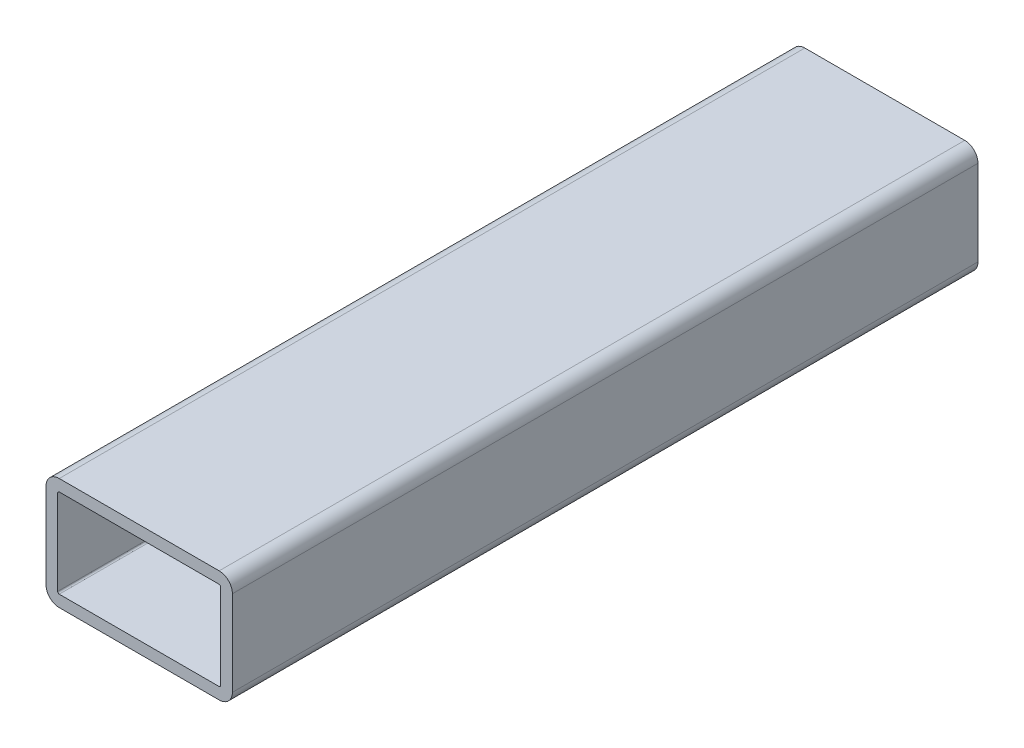
ISO-10303-21;
HEADER;
FILE_DESCRIPTION(('STEP AP214'),'2;1');
FILE_NAME('part.step','',(''),(''),'','','');
FILE_SCHEMA(('AUTOMOTIVE_DESIGN { 1 0 10303 214 1 1 1 1 }'));
ENDSEC;
DATA;
#1=APPLICATION_CONTEXT('core data for automotive mechanical design processes');
#2=APPLICATION_PROTOCOL_DEFINITION('international standard','automotive_design',2000,#1);
#3=PRODUCT_CONTEXT('',#1,'mechanical');
#4=PRODUCT('Part','Part','',(#3));
#5=PRODUCT_RELATED_PRODUCT_CATEGORY('part','',(#4));
#6=PRODUCT_DEFINITION_FORMATION('','',#4);
#7=PRODUCT_DEFINITION_CONTEXT('part definition',#1,'design');
#8=PRODUCT_DEFINITION('design','',#6,#7);
#9=PRODUCT_DEFINITION_SHAPE('','',#8);
#10=(LENGTH_UNIT() NAMED_UNIT(*) SI_UNIT(.MILLI.,.METRE.));
#11=(NAMED_UNIT(*) PLANE_ANGLE_UNIT() SI_UNIT($,.RADIAN.));
#12=(NAMED_UNIT(*) SI_UNIT($,.STERADIAN.) SOLID_ANGLE_UNIT());
#13=UNCERTAINTY_MEASURE_WITH_UNIT(LENGTH_MEASURE(1.E-05),#10,'distance_accuracy_value','');
#14=(GEOMETRIC_REPRESENTATION_CONTEXT(3) GLOBAL_UNCERTAINTY_ASSIGNED_CONTEXT((#13)) GLOBAL_UNIT_ASSIGNED_CONTEXT((#10,
#11,#12)) REPRESENTATION_CONTEXT('',''));
#15=CARTESIAN_POINT('',(0.,0.,0.));
#16=DIRECTION('',(0.,0.,1.));
#17=DIRECTION('',(1.,0.,0.));
#18=AXIS2_PLACEMENT_3D('',#15,#16,#17);
#19=CARTESIAN_POINT('',(-85.8000000000001,45.7999999999997,400.));
#20=DIRECTION('',(0.,0.,-1.));
#21=DIRECTION('',(-1.,0.,0.));
#22=AXIS2_PLACEMENT_3D('',#19,#20,#21);
#23=CYLINDRICAL_SURFACE('',#22,14.2000000000001);
#24=CARTESIAN_POINT('',(-85.8000000000001,45.7999999999997,-400.));
#25=DIRECTION('',(0.,0.,1.));
#26=DIRECTION('',(1.,0.,0.));
#27=AXIS2_PLACEMENT_3D('',#24,#25,#26);
#28=CIRCLE('',#27,14.2000000000001);
#29=CARTESIAN_POINT('',(-85.8000000000001,59.9999999999997,-400.));
#30=VERTEX_POINT('',#29);
#31=CARTESIAN_POINT('',(-100.,45.7999999999996,-400.));
#32=VERTEX_POINT('',#31);
#33=EDGE_CURVE('E237',#30,#32,#28,.T.);
#34=ORIENTED_EDGE('',*,*,#33,.T.);
#35=DIRECTION('',(0.,0.,-1.));
#36=VECTOR('',#35,1.);
#37=CARTESIAN_POINT('',(-100.,45.7999999999996,400.));
#38=LINE('',#37,#36);
#39=CARTESIAN_POINT('',(-100.,45.7999999999996,400.));
#40=VERTEX_POINT('',#39);
#41=EDGE_CURVE('E12',#40,#32,#38,.T.);
#42=ORIENTED_EDGE('',*,*,#41,.F.);
#43=CARTESIAN_POINT('',(-85.8000000000001,45.7999999999997,400.));
#44=DIRECTION('',(0.,0.,1.));
#45=DIRECTION('',(1.,0.,0.));
#46=AXIS2_PLACEMENT_3D('',#43,#44,#45);
#47=CIRCLE('',#46,14.2000000000001);
#48=CARTESIAN_POINT('',(-85.8000000000001,59.9999999999997,400.));
#49=VERTEX_POINT('',#48);
#50=EDGE_CURVE('E315',#49,#40,#47,.T.);
#51=ORIENTED_EDGE('',*,*,#50,.F.);
#52=DIRECTION('',(0.,0.,-1.));
#53=VECTOR('',#52,1.);
#54=CARTESIAN_POINT('',(-85.8000000000001,59.9999999999997,400.));
#55=LINE('',#54,#53);
#56=EDGE_CURVE('E252',#49,#30,#55,.T.);
#57=ORIENTED_EDGE('',*,*,#56,.T.);
#58=EDGE_LOOP('',(#34,#42,#51,#57));
#59=FACE_BOUND('',#58,.T.);
#60=ADVANCED_FACE('F65',(#59),#23,.T.);
#61=CARTESIAN_POINT('',(-100.,45.7999999999996,400.));
#62=DIRECTION('',(1.,0.,0.));
#63=DIRECTION('',(0.,1.,0.));
#64=AXIS2_PLACEMENT_3D('',#61,#62,#63);
#65=PLANE('',#64);
#66=DIRECTION('',(0.,-1.,0.));
#67=VECTOR('',#66,1.);
#68=CARTESIAN_POINT('',(-100.,45.7999999999996,-400.));
#69=LINE('',#68,#67);
#70=CARTESIAN_POINT('',(-99.9999999999998,-45.8000000000003,-400.));
#71=VERTEX_POINT('',#70);
#72=EDGE_CURVE('E240',#32,#71,#69,.T.);
#73=ORIENTED_EDGE('',*,*,#72,.T.);
#74=DIRECTION('',(0.,0.,-1.));
#75=VECTOR('',#74,1.);
#76=CARTESIAN_POINT('',(-99.9999999999998,-45.8000000000003,400.));
#77=LINE('',#76,#75);
#78=CARTESIAN_POINT('',(-99.9999999999998,-45.8000000000003,400.));
#79=VERTEX_POINT('',#78);
#80=EDGE_CURVE('E75',#79,#71,#77,.T.);
#81=ORIENTED_EDGE('',*,*,#80,.F.);
#82=DIRECTION('',(0.,-1.,0.));
#83=VECTOR('',#82,1.);
#84=CARTESIAN_POINT('',(-100.,45.7999999999996,400.));
#85=LINE('',#84,#83);
#86=EDGE_CURVE('E317',#40,#79,#85,.T.);
#87=ORIENTED_EDGE('',*,*,#86,.F.);
#88=ORIENTED_EDGE('',*,*,#41,.T.);
#89=EDGE_LOOP('',(#73,#81,#87,#88));
#90=FACE_BOUND('',#89,.T.);
#91=ADVANCED_FACE('F352',(#90),#65,.F.);
#92=CARTESIAN_POINT('',(-85.7999999999998,-45.8000000000003,400.));
#93=DIRECTION('',(0.,0.,-1.));
#94=DIRECTION('',(-1.,0.,0.));
#95=AXIS2_PLACEMENT_3D('',#92,#93,#94);
#96=CYLINDRICAL_SURFACE('',#95,14.2000000000001);
#97=CARTESIAN_POINT('',(-85.7999999999998,-45.8000000000003,-400.));
#98=DIRECTION('',(0.,0.,1.));
#99=DIRECTION('',(1.,0.,0.));
#100=AXIS2_PLACEMENT_3D('',#97,#98,#99);
#101=CIRCLE('',#100,14.2000000000001);
#102=CARTESIAN_POINT('',(-85.7999999999997,-60.0000000000003,-400.));
#103=VERTEX_POINT('',#102);
#104=EDGE_CURVE('E242',#71,#103,#101,.T.);
#105=ORIENTED_EDGE('',*,*,#104,.T.);
#106=DIRECTION('',(0.,0.,-1.));
#107=VECTOR('',#106,1.);
#108=CARTESIAN_POINT('',(-85.7999999999997,-60.0000000000003,400.));
#109=LINE('',#108,#107);
#110=CARTESIAN_POINT('',(-85.7999999999997,-60.0000000000003,400.));
#111=VERTEX_POINT('',#110);
#112=EDGE_CURVE('E259',#111,#103,#109,.T.);
#113=ORIENTED_EDGE('',*,*,#112,.F.);
#114=CARTESIAN_POINT('',(-85.7999999999998,-45.8000000000003,400.));
#115=DIRECTION('',(0.,0.,1.));
#116=DIRECTION('',(1.,0.,0.));
#117=AXIS2_PLACEMENT_3D('',#114,#115,#116);
#118=CIRCLE('',#117,14.2000000000001);
#119=EDGE_CURVE('E319',#79,#111,#118,.T.);
#120=ORIENTED_EDGE('',*,*,#119,.F.);
#121=ORIENTED_EDGE('',*,*,#80,.T.);
#122=EDGE_LOOP('',(#105,#113,#120,#121));
#123=FACE_BOUND('',#122,.T.);
#124=ADVANCED_FACE('F357',(#123),#96,.T.);
#125=CARTESIAN_POINT('',(85.8000000000002,-59.9999999999997,400.));
#126=DIRECTION('',(0.,1.,0.));
#127=DIRECTION('',(-1.,0.,0.));
#128=AXIS2_PLACEMENT_3D('',#125,#126,#127);
#129=PLANE('',#128);
#130=DIRECTION('',(1.,0.,0.));
#131=VECTOR('',#130,1.);
#132=CARTESIAN_POINT('',(85.8000000000002,-59.9999999999997,-400.));
#133=LINE('',#132,#131);
#134=CARTESIAN_POINT('',(85.8000000000002,-59.9999999999997,-400.));
#135=VERTEX_POINT('',#134);
#136=EDGE_CURVE('E244',#103,#135,#133,.T.);
#137=ORIENTED_EDGE('',*,*,#136,.T.);
#138=DIRECTION('',(0.,0.,-1.));
#139=VECTOR('',#138,1.);
#140=CARTESIAN_POINT('',(85.8000000000002,-59.9999999999997,400.));
#141=LINE('',#140,#139);
#142=CARTESIAN_POINT('',(85.8000000000002,-59.9999999999997,400.));
#143=VERTEX_POINT('',#142);
#144=EDGE_CURVE('E256',#143,#135,#141,.T.);
#145=ORIENTED_EDGE('',*,*,#144,.F.);
#146=DIRECTION('',(1.,0.,0.));
#147=VECTOR('',#146,1.);
#148=CARTESIAN_POINT('',(85.8000000000002,-59.9999999999997,400.));
#149=LINE('',#148,#147);
#150=EDGE_CURVE('E321',#111,#143,#149,.T.);
#151=ORIENTED_EDGE('',*,*,#150,.F.);
#152=ORIENTED_EDGE('',*,*,#112,.T.);
#153=EDGE_LOOP('',(#137,#145,#151,#152));
#154=FACE_BOUND('',#153,.T.);
#155=ADVANCED_FACE('F327',(#154),#129,.F.);
#156=CARTESIAN_POINT('',(85.8000000000001,-45.7999999999996,400.));
#157=DIRECTION('',(0.,0.,-1.));
#158=DIRECTION('',(-1.,0.,0.));
#159=AXIS2_PLACEMENT_3D('',#156,#157,#158);
#160=CYLINDRICAL_SURFACE('',#159,14.2000000000001);
#161=CARTESIAN_POINT('',(85.8000000000001,-45.7999999999996,-400.));
#162=DIRECTION('',(0.,0.,1.));
#163=DIRECTION('',(1.,0.,0.));
#164=AXIS2_PLACEMENT_3D('',#161,#162,#163);
#165=CIRCLE('',#164,14.2000000000001);
#166=CARTESIAN_POINT('',(100.,-45.7999999999996,-400.));
#167=VERTEX_POINT('',#166);
#168=EDGE_CURVE('E246',#135,#167,#165,.T.);
#169=ORIENTED_EDGE('',*,*,#168,.T.);
#170=DIRECTION('',(0.,0.,-1.));
#171=VECTOR('',#170,1.);
#172=CARTESIAN_POINT('',(100.,-45.7999999999996,400.));
#173=LINE('',#172,#171);
#174=CARTESIAN_POINT('',(100.,-45.7999999999996,400.));
#175=VERTEX_POINT('',#174);
#176=EDGE_CURVE('E204',#175,#167,#173,.T.);
#177=ORIENTED_EDGE('',*,*,#176,.F.);
#178=CARTESIAN_POINT('',(85.8000000000001,-45.7999999999996,400.));
#179=DIRECTION('',(0.,0.,1.));
#180=DIRECTION('',(1.,0.,0.));
#181=AXIS2_PLACEMENT_3D('',#178,#179,#180);
#182=CIRCLE('',#181,14.2000000000001);
#183=EDGE_CURVE('E195',#143,#175,#182,.T.);
#184=ORIENTED_EDGE('',*,*,#183,.F.);
#185=ORIENTED_EDGE('',*,*,#144,.T.);
#186=EDGE_LOOP('',(#169,#177,#184,#185));
#187=FACE_BOUND('',#186,.T.);
#188=ADVANCED_FACE('F331',(#187),#160,.T.);
#189=CARTESIAN_POINT('',(100.,-45.7999999999996,400.));
#190=DIRECTION('',(-1.,0.,0.));
#191=DIRECTION('',(0.,-1.,0.));
#192=AXIS2_PLACEMENT_3D('',#189,#190,#191);
#193=PLANE('',#192);
#194=DIRECTION('',(0.,1.,0.));
#195=VECTOR('',#194,1.);
#196=CARTESIAN_POINT('',(100.,-45.7999999999996,-400.));
#197=LINE('',#196,#195);
#198=CARTESIAN_POINT('',(99.9999999999998,45.8000000000003,-400.));
#199=VERTEX_POINT('',#198);
#200=EDGE_CURVE('E203',#167,#199,#197,.T.);
#201=ORIENTED_EDGE('',*,*,#200,.T.);
#202=DIRECTION('',(0.,0.,-1.));
#203=VECTOR('',#202,1.);
#204=CARTESIAN_POINT('',(99.9999999999998,45.8000000000003,400.));
#205=LINE('',#204,#203);
#206=CARTESIAN_POINT('',(99.9999999999998,45.8000000000003,400.));
#207=VERTEX_POINT('',#206);
#208=EDGE_CURVE('E200',#207,#199,#205,.T.);
#209=ORIENTED_EDGE('',*,*,#208,.F.);
#210=DIRECTION('',(0.,1.,0.));
#211=VECTOR('',#210,1.);
#212=CARTESIAN_POINT('',(100.,-45.7999999999996,400.));
#213=LINE('',#212,#211);
#214=EDGE_CURVE('E189',#175,#207,#213,.T.);
#215=ORIENTED_EDGE('',*,*,#214,.F.);
#216=ORIENTED_EDGE('',*,*,#176,.T.);
#217=EDGE_LOOP('',(#201,#209,#215,#216));
#218=FACE_BOUND('',#217,.T.);
#219=ADVANCED_FACE('F201',(#218),#193,.F.);
#220=CARTESIAN_POINT('',(85.7999999999998,45.8000000000003,400.));
#221=DIRECTION('',(0.,0.,-1.));
#222=DIRECTION('',(-1.,0.,0.));
#223=AXIS2_PLACEMENT_3D('',#220,#221,#222);
#224=CYLINDRICAL_SURFACE('',#223,14.2000000000001);
#225=CARTESIAN_POINT('',(85.7999999999998,45.8000000000003,-400.));
#226=DIRECTION('',(0.,0.,1.));
#227=DIRECTION('',(1.,0.,0.));
#228=AXIS2_PLACEMENT_3D('',#225,#226,#227);
#229=CIRCLE('',#228,14.2000000000001);
#230=CARTESIAN_POINT('',(85.7999999999997,60.0000000000003,-400.));
#231=VERTEX_POINT('',#230);
#232=EDGE_CURVE('E137',#199,#231,#229,.T.);
#233=ORIENTED_EDGE('',*,*,#232,.T.);
#234=DIRECTION('',(0.,0.,-1.));
#235=VECTOR('',#234,1.);
#236=CARTESIAN_POINT('',(85.7999999999997,60.0000000000003,400.));
#237=LINE('',#236,#235);
#238=CARTESIAN_POINT('',(85.7999999999997,60.0000000000003,400.));
#239=VERTEX_POINT('',#238);
#240=EDGE_CURVE('E205',#239,#231,#237,.T.);
#241=ORIENTED_EDGE('',*,*,#240,.F.);
#242=CARTESIAN_POINT('',(85.7999999999998,45.8000000000003,400.));
#243=DIRECTION('',(0.,0.,1.));
#244=DIRECTION('',(1.,0.,0.));
#245=AXIS2_PLACEMENT_3D('',#242,#243,#244);
#246=CIRCLE('',#245,14.2000000000001);
#247=EDGE_CURVE('E193',#207,#239,#246,.T.);
#248=ORIENTED_EDGE('',*,*,#247,.F.);
#249=ORIENTED_EDGE('',*,*,#208,.T.);
#250=EDGE_LOOP('',(#233,#241,#248,#249));
#251=FACE_BOUND('',#250,.T.);
#252=ADVANCED_FACE('F207',(#251),#224,.T.);
#253=CARTESIAN_POINT('',(-85.7999999999998,-45.8000000000003,400.));
#254=DIRECTION('',(0.,0.,-1.));
#255=DIRECTION('',(-1.,0.,0.));
#256=AXIS2_PLACEMENT_3D('',#253,#254,#255);
#257=CYLINDRICAL_SURFACE('',#256,1.70000000000003);
#258=CARTESIAN_POINT('',(-85.7999999999998,-45.8000000000003,-400.));
#259=DIRECTION('',(0.,0.,1.));
#260=DIRECTION('',(1.,0.,0.));
#261=AXIS2_PLACEMENT_3D('',#258,#259,#260);
#262=CIRCLE('',#261,1.70000000000003);
#263=CARTESIAN_POINT('',(-87.4999999999998,-45.8000000000002,-400.));
#264=VERTEX_POINT('',#263);
#265=CARTESIAN_POINT('',(-85.7999999999998,-47.5000000000003,-400.));
#266=VERTEX_POINT('',#265);
#267=EDGE_CURVE('E213',#264,#266,#262,.T.);
#268=ORIENTED_EDGE('',*,*,#267,.F.);
#269=DIRECTION('',(0.,0.,-1.));
#270=VECTOR('',#269,1.);
#271=CARTESIAN_POINT('',(-87.4999999999998,-45.8000000000002,400.));
#272=LINE('',#271,#270);
#273=CARTESIAN_POINT('',(-87.4999999999998,-45.8000000000002,400.));
#274=VERTEX_POINT('',#273);
#275=EDGE_CURVE('E69',#274,#264,#272,.T.);
#276=ORIENTED_EDGE('',*,*,#275,.F.);
#277=CARTESIAN_POINT('',(-85.7999999999998,-45.8000000000003,400.));
#278=DIRECTION('',(0.,0.,1.));
#279=DIRECTION('',(1.,0.,0.));
#280=AXIS2_PLACEMENT_3D('',#277,#278,#279);
#281=CIRCLE('',#280,1.70000000000003);
#282=CARTESIAN_POINT('',(-85.7999999999998,-47.5000000000003,400.));
#283=VERTEX_POINT('',#282);
#284=EDGE_CURVE('E251',#274,#283,#281,.T.);
#285=ORIENTED_EDGE('',*,*,#284,.T.);
#286=DIRECTION('',(0.,0.,-1.));
#287=VECTOR('',#286,1.);
#288=CARTESIAN_POINT('',(-85.7999999999998,-47.5000000000003,400.));
#289=LINE('',#288,#287);
#290=EDGE_CURVE('E209',#283,#266,#289,.T.);
#291=ORIENTED_EDGE('',*,*,#290,.T.);
#292=EDGE_LOOP('',(#268,#276,#285,#291));
#293=FACE_BOUND('',#292,.T.);
#294=ADVANCED_FACE('F67',(#293),#257,.F.);
#295=CARTESIAN_POINT('',(-87.5000000000001,45.7999999999996,400.));
#296=DIRECTION('',(1.,0.,0.));
#297=DIRECTION('',(0.,1.,0.));
#298=AXIS2_PLACEMENT_3D('',#295,#296,#297);
#299=PLANE('',#298);
#300=DIRECTION('',(0.,-1.,0.));
#301=VECTOR('',#300,1.);
#302=CARTESIAN_POINT('',(-87.5000000000001,45.7999999999996,-400.));
#303=LINE('',#302,#301);
#304=CARTESIAN_POINT('',(-87.5000000000001,45.7999999999996,-400.));
#305=VERTEX_POINT('',#304);
#306=EDGE_CURVE('E216',#305,#264,#303,.T.);
#307=ORIENTED_EDGE('',*,*,#306,.F.);
#308=DIRECTION('',(0.,0.,-1.));
#309=VECTOR('',#308,1.);
#310=CARTESIAN_POINT('',(-87.5000000000001,45.7999999999996,400.));
#311=LINE('',#310,#309);
#312=CARTESIAN_POINT('',(-87.5000000000001,45.7999999999996,400.));
#313=VERTEX_POINT('',#312);
#314=EDGE_CURVE('E274',#313,#305,#311,.T.);
#315=ORIENTED_EDGE('',*,*,#314,.F.);
#316=DIRECTION('',(0.,-1.,0.));
#317=VECTOR('',#316,1.);
#318=CARTESIAN_POINT('',(-87.5000000000001,45.7999999999996,400.));
#319=LINE('',#318,#317);
#320=EDGE_CURVE('E283',#313,#274,#319,.T.);
#321=ORIENTED_EDGE('',*,*,#320,.T.);
#322=ORIENTED_EDGE('',*,*,#275,.T.);
#323=EDGE_LOOP('',(#307,#315,#321,#322));
#324=FACE_BOUND('',#323,.T.);
#325=ADVANCED_FACE('F281',(#324),#299,.T.);
#326=CARTESIAN_POINT('',(-85.8000000000001,45.7999999999997,400.));
#327=DIRECTION('',(0.,0.,-1.));
#328=DIRECTION('',(-1.,0.,0.));
#329=AXIS2_PLACEMENT_3D('',#326,#327,#328);
#330=CYLINDRICAL_SURFACE('',#329,1.70000000000003);
#331=CARTESIAN_POINT('',(-85.8000000000001,45.7999999999997,-400.));
#332=DIRECTION('',(0.,0.,1.));
#333=DIRECTION('',(1.,0.,0.));
#334=AXIS2_PLACEMENT_3D('',#331,#332,#333);
#335=CIRCLE('',#334,1.70000000000003);
#336=CARTESIAN_POINT('',(-85.8000000000001,47.4999999999997,-400.));
#337=VERTEX_POINT('',#336);
#338=EDGE_CURVE('E219',#337,#305,#335,.T.);
#339=ORIENTED_EDGE('',*,*,#338,.F.);
#340=DIRECTION('',(0.,0.,-1.));
#341=VECTOR('',#340,1.);
#342=CARTESIAN_POINT('',(-85.8000000000001,47.4999999999997,400.));
#343=LINE('',#342,#341);
#344=CARTESIAN_POINT('',(-85.8000000000001,47.4999999999997,400.));
#345=VERTEX_POINT('',#344);
#346=EDGE_CURVE('E273',#345,#337,#343,.T.);
#347=ORIENTED_EDGE('',*,*,#346,.F.);
#348=CARTESIAN_POINT('',(-85.8000000000001,45.7999999999997,400.));
#349=DIRECTION('',(0.,0.,1.));
#350=DIRECTION('',(1.,0.,0.));
#351=AXIS2_PLACEMENT_3D('',#348,#349,#350);
#352=CIRCLE('',#351,1.70000000000003);
#353=EDGE_CURVE('E291',#345,#313,#352,.T.);
#354=ORIENTED_EDGE('',*,*,#353,.T.);
#355=ORIENTED_EDGE('',*,*,#314,.T.);
#356=EDGE_LOOP('',(#339,#347,#354,#355));
#357=FACE_BOUND('',#356,.T.);
#358=ADVANCED_FACE('F289',(#357),#330,.F.);
#359=CARTESIAN_POINT('',(-85.8000000000001,47.4999999999997,400.));
#360=DIRECTION('',(0.,-1.,0.));
#361=DIRECTION('',(1.,0.,0.));
#362=AXIS2_PLACEMENT_3D('',#359,#360,#361);
#363=PLANE('',#362);
#364=DIRECTION('',(-1.,0.,0.));
#365=VECTOR('',#364,1.);
#366=CARTESIAN_POINT('',(-85.8000000000001,47.4999999999997,-400.));
#367=LINE('',#366,#365);
#368=CARTESIAN_POINT('',(85.7999999999998,47.5000000000003,-400.));
#369=VERTEX_POINT('',#368);
#370=EDGE_CURVE('E222',#369,#337,#367,.T.);
#371=ORIENTED_EDGE('',*,*,#370,.F.);
#372=DIRECTION('',(0.,0.,-1.));
#373=VECTOR('',#372,1.);
#374=CARTESIAN_POINT('',(85.7999999999998,47.5000000000003,400.));
#375=LINE('',#374,#373);
#376=CARTESIAN_POINT('',(85.7999999999998,47.5000000000003,400.));
#377=VERTEX_POINT('',#376);
#378=EDGE_CURVE('E271',#377,#369,#375,.T.);
#379=ORIENTED_EDGE('',*,*,#378,.F.);
#380=DIRECTION('',(-1.,0.,0.));
#381=VECTOR('',#380,1.);
#382=CARTESIAN_POINT('',(-85.8000000000001,47.4999999999997,400.));
#383=LINE('',#382,#381);
#384=EDGE_CURVE('E297',#377,#345,#383,.T.);
#385=ORIENTED_EDGE('',*,*,#384,.T.);
#386=ORIENTED_EDGE('',*,*,#346,.T.);
#387=EDGE_LOOP('',(#371,#379,#385,#386));
#388=FACE_BOUND('',#387,.T.);
#389=ADVANCED_FACE('F300',(#388),#363,.T.);
#390=CARTESIAN_POINT('',(85.7999999999998,45.8000000000003,400.));
#391=DIRECTION('',(0.,0.,-1.));
#392=DIRECTION('',(-1.,0.,0.));
#393=AXIS2_PLACEMENT_3D('',#390,#391,#392);
#394=CYLINDRICAL_SURFACE('',#393,1.70000000000003);
#395=CARTESIAN_POINT('',(85.7999999999998,45.8000000000003,-400.));
#396=DIRECTION('',(0.,0.,1.));
#397=DIRECTION('',(1.,0.,0.));
#398=AXIS2_PLACEMENT_3D('',#395,#396,#397);
#399=CIRCLE('',#398,1.70000000000003);
#400=CARTESIAN_POINT('',(87.4999999999998,45.8000000000002,-400.));
#401=VERTEX_POINT('',#400);
#402=EDGE_CURVE('E225',#401,#369,#399,.T.);
#403=ORIENTED_EDGE('',*,*,#402,.F.);
#404=DIRECTION('',(0.,0.,-1.));
#405=VECTOR('',#404,1.);
#406=CARTESIAN_POINT('',(87.4999999999998,45.8000000000002,400.));
#407=LINE('',#406,#405);
#408=CARTESIAN_POINT('',(87.4999999999998,45.8000000000002,400.));
#409=VERTEX_POINT('',#408);
#410=EDGE_CURVE('E269',#409,#401,#407,.T.);
#411=ORIENTED_EDGE('',*,*,#410,.F.);
#412=CARTESIAN_POINT('',(85.7999999999998,45.8000000000003,400.));
#413=DIRECTION('',(0.,0.,1.));
#414=DIRECTION('',(1.,0.,0.));
#415=AXIS2_PLACEMENT_3D('',#412,#413,#414);
#416=CIRCLE('',#415,1.70000000000003);
#417=EDGE_CURVE('E301',#409,#377,#416,.T.);
#418=ORIENTED_EDGE('',*,*,#417,.T.);
#419=ORIENTED_EDGE('',*,*,#378,.T.);
#420=EDGE_LOOP('',(#403,#411,#418,#419));
#421=FACE_BOUND('',#420,.T.);
#422=ADVANCED_FACE('F368',(#421),#394,.F.);
#423=CARTESIAN_POINT('',(87.5000000000001,-45.7999999999996,400.));
#424=DIRECTION('',(-1.,0.,0.));
#425=DIRECTION('',(0.,-1.,0.));
#426=AXIS2_PLACEMENT_3D('',#423,#424,#425);
#427=PLANE('',#426);
#428=DIRECTION('',(0.,1.,0.));
#429=VECTOR('',#428,1.);
#430=CARTESIAN_POINT('',(87.5000000000001,-45.7999999999996,-400.));
#431=LINE('',#430,#429);
#432=CARTESIAN_POINT('',(87.5000000000001,-45.7999999999996,-400.));
#433=VERTEX_POINT('',#432);
#434=EDGE_CURVE('E228',#433,#401,#431,.T.);
#435=ORIENTED_EDGE('',*,*,#434,.F.);
#436=DIRECTION('',(0.,0.,-1.));
#437=VECTOR('',#436,1.);
#438=CARTESIAN_POINT('',(87.5000000000001,-45.7999999999996,400.));
#439=LINE('',#438,#437);
#440=CARTESIAN_POINT('',(87.5000000000001,-45.7999999999996,400.));
#441=VERTEX_POINT('',#440);
#442=EDGE_CURVE('E267',#441,#433,#439,.T.);
#443=ORIENTED_EDGE('',*,*,#442,.F.);
#444=DIRECTION('',(0.,1.,0.));
#445=VECTOR('',#444,1.);
#446=CARTESIAN_POINT('',(87.5000000000001,-45.7999999999996,400.));
#447=LINE('',#446,#445);
#448=EDGE_CURVE('E303',#441,#409,#447,.T.);
#449=ORIENTED_EDGE('',*,*,#448,.T.);
#450=ORIENTED_EDGE('',*,*,#410,.T.);
#451=EDGE_LOOP('',(#435,#443,#449,#450));
#452=FACE_BOUND('',#451,.T.);
#453=ADVANCED_FACE('F364',(#452),#427,.T.);
#454=CARTESIAN_POINT('',(85.8000000000001,-45.7999999999996,400.));
#455=DIRECTION('',(0.,0.,-1.));
#456=DIRECTION('',(-1.,0.,0.));
#457=AXIS2_PLACEMENT_3D('',#454,#455,#456);
#458=CYLINDRICAL_SURFACE('',#457,1.70000000000002);
#459=CARTESIAN_POINT('',(85.8000000000001,-45.7999999999996,-400.));
#460=DIRECTION('',(0.,0.,1.));
#461=DIRECTION('',(1.,0.,0.));
#462=AXIS2_PLACEMENT_3D('',#459,#460,#461);
#463=CIRCLE('',#462,1.70000000000002);
#464=CARTESIAN_POINT('',(85.8000000000001,-47.4999999999996,-400.));
#465=VERTEX_POINT('',#464);
#466=EDGE_CURVE('E231',#465,#433,#463,.T.);
#467=ORIENTED_EDGE('',*,*,#466,.F.);
#468=DIRECTION('',(0.,0.,-1.));
#469=VECTOR('',#468,1.);
#470=CARTESIAN_POINT('',(85.8000000000001,-47.4999999999996,400.));
#471=LINE('',#470,#469);
#472=CARTESIAN_POINT('',(85.8000000000001,-47.4999999999996,400.));
#473=VERTEX_POINT('',#472);
#474=EDGE_CURVE('E265',#473,#465,#471,.T.);
#475=ORIENTED_EDGE('',*,*,#474,.F.);
#476=CARTESIAN_POINT('',(85.8000000000001,-45.7999999999996,400.));
#477=DIRECTION('',(0.,0.,1.));
#478=DIRECTION('',(1.,0.,0.));
#479=AXIS2_PLACEMENT_3D('',#476,#477,#478);
#480=CIRCLE('',#479,1.70000000000002);
#481=EDGE_CURVE('E309',#473,#441,#480,.T.);
#482=ORIENTED_EDGE('',*,*,#481,.T.);
#483=ORIENTED_EDGE('',*,*,#442,.T.);
#484=EDGE_LOOP('',(#467,#475,#482,#483));
#485=FACE_BOUND('',#484,.T.);
#486=ADVANCED_FACE('F346',(#485),#458,.F.);
#487=CARTESIAN_POINT('',(85.8000000000001,-47.4999999999997,400.));
#488=DIRECTION('',(0.,1.,0.));
#489=DIRECTION('',(-1.,0.,0.));
#490=AXIS2_PLACEMENT_3D('',#487,#488,#489);
#491=PLANE('',#490);
#492=DIRECTION('',(1.,0.,0.));
#493=VECTOR('',#492,1.);
#494=CARTESIAN_POINT('',(85.8000000000001,-47.4999999999997,-400.));
#495=LINE('',#494,#493);
#496=EDGE_CURVE('E234',#266,#465,#495,.T.);
#497=ORIENTED_EDGE('',*,*,#496,.F.);
#498=ORIENTED_EDGE('',*,*,#290,.F.);
#499=DIRECTION('',(1.,0.,0.));
#500=VECTOR('',#499,1.);
#501=CARTESIAN_POINT('',(85.8000000000001,-47.4999999999997,400.));
#502=LINE('',#501,#500);
#503=EDGE_CURVE('E312',#283,#473,#502,.T.);
#504=ORIENTED_EDGE('',*,*,#503,.T.);
#505=ORIENTED_EDGE('',*,*,#474,.T.);
#506=EDGE_LOOP('',(#497,#498,#504,#505));
#507=FACE_BOUND('',#506,.T.);
#508=ADVANCED_FACE('F339',(#507),#491,.T.);
#509=CARTESIAN_POINT('',(-85.8000000000001,59.9999999999997,400.));
#510=DIRECTION('',(0.,-1.,0.));
#511=DIRECTION('',(1.,0.,0.));
#512=AXIS2_PLACEMENT_3D('',#509,#510,#511);
#513=PLANE('',#512);
#514=DIRECTION('',(-1.,0.,0.));
#515=VECTOR('',#514,1.);
#516=CARTESIAN_POINT('',(-85.8000000000001,59.9999999999997,-400.));
#517=LINE('',#516,#515);
#518=EDGE_CURVE('E143',#231,#30,#517,.T.);
#519=ORIENTED_EDGE('',*,*,#518,.T.);
#520=ORIENTED_EDGE('',*,*,#56,.F.);
#521=DIRECTION('',(-1.,0.,0.));
#522=VECTOR('',#521,1.);
#523=CARTESIAN_POINT('',(-85.8000000000001,59.9999999999997,400.));
#524=LINE('',#523,#522);
#525=EDGE_CURVE('E84',#239,#49,#524,.T.);
#526=ORIENTED_EDGE('',*,*,#525,.F.);
#527=ORIENTED_EDGE('',*,*,#240,.T.);
#528=EDGE_LOOP('',(#519,#520,#526,#527));
#529=FACE_BOUND('',#528,.T.);
#530=ADVANCED_FACE('F337',(#529),#513,.F.);
#531=CARTESIAN_POINT('',(-85.8000000000001,45.7999999999997,400.));
#532=DIRECTION('',(0.,0.,1.));
#533=DIRECTION('',(1.,0.,0.));
#534=AXIS2_PLACEMENT_3D('',#531,#532,#533);
#535=PLANE('',#534);
#536=ORIENTED_EDGE('',*,*,#284,.F.);
#537=ORIENTED_EDGE('',*,*,#320,.F.);
#538=ORIENTED_EDGE('',*,*,#353,.F.);
#539=ORIENTED_EDGE('',*,*,#384,.F.);
#540=ORIENTED_EDGE('',*,*,#417,.F.);
#541=ORIENTED_EDGE('',*,*,#448,.F.);
#542=ORIENTED_EDGE('',*,*,#481,.F.);
#543=ORIENTED_EDGE('',*,*,#503,.F.);
#544=EDGE_LOOP('',(#536,#537,#538,#539,#540,#541,#542,#543));
#545=FACE_BOUND('',#544,.T.);
#546=ORIENTED_EDGE('',*,*,#50,.T.);
#547=ORIENTED_EDGE('',*,*,#86,.T.);
#548=ORIENTED_EDGE('',*,*,#119,.T.);
#549=ORIENTED_EDGE('',*,*,#150,.T.);
#550=ORIENTED_EDGE('',*,*,#183,.T.);
#551=ORIENTED_EDGE('',*,*,#214,.T.);
#552=ORIENTED_EDGE('',*,*,#247,.T.);
#553=ORIENTED_EDGE('',*,*,#525,.T.);
#554=EDGE_LOOP('',(#546,#547,#548,#549,#550,#551,#552,#553));
#555=FACE_BOUND('',#554,.T.);
#556=ADVANCED_FACE('F191',(#545,#555),#535,.T.);
#557=CARTESIAN_POINT('',(-85.8000000000001,45.7999999999997,-400.));
#558=DIRECTION('',(0.,0.,1.));
#559=DIRECTION('',(1.,0.,0.));
#560=AXIS2_PLACEMENT_3D('',#557,#558,#559);
#561=PLANE('',#560);
#562=ORIENTED_EDGE('',*,*,#267,.T.);
#563=ORIENTED_EDGE('',*,*,#496,.T.);
#564=ORIENTED_EDGE('',*,*,#466,.T.);
#565=ORIENTED_EDGE('',*,*,#434,.T.);
#566=ORIENTED_EDGE('',*,*,#402,.T.);
#567=ORIENTED_EDGE('',*,*,#370,.T.);
#568=ORIENTED_EDGE('',*,*,#338,.T.);
#569=ORIENTED_EDGE('',*,*,#306,.T.);
#570=EDGE_LOOP('',(#562,#563,#564,#565,#566,#567,#568,#569));
#571=FACE_BOUND('',#570,.T.);
#572=ORIENTED_EDGE('',*,*,#33,.F.);
#573=ORIENTED_EDGE('',*,*,#518,.F.);
#574=ORIENTED_EDGE('',*,*,#232,.F.);
#575=ORIENTED_EDGE('',*,*,#200,.F.);
#576=ORIENTED_EDGE('',*,*,#168,.F.);
#577=ORIENTED_EDGE('',*,*,#136,.F.);
#578=ORIENTED_EDGE('',*,*,#104,.F.);
#579=ORIENTED_EDGE('',*,*,#72,.F.);
#580=EDGE_LOOP('',(#572,#573,#574,#575,#576,#577,#578,#579));
#581=FACE_BOUND('',#580,.T.);
#582=ADVANCED_FACE('F286',(#571,#581),#561,.F.);
#583=CLOSED_SHELL('',(#60,#91,#124,#155,#188,#219,#252,#294,#325,#358,#389,#422,#453,#486,#508,
#530,#556,#582));
#584=MANIFOLD_SOLID_BREP('B2',#583);
#585=ADVANCED_BREP_SHAPE_REPRESENTATION('',(#18,#584),#14);
#586=SHAPE_DEFINITION_REPRESENTATION(#9,#585);
ENDSEC;
END-ISO-10303-21;
